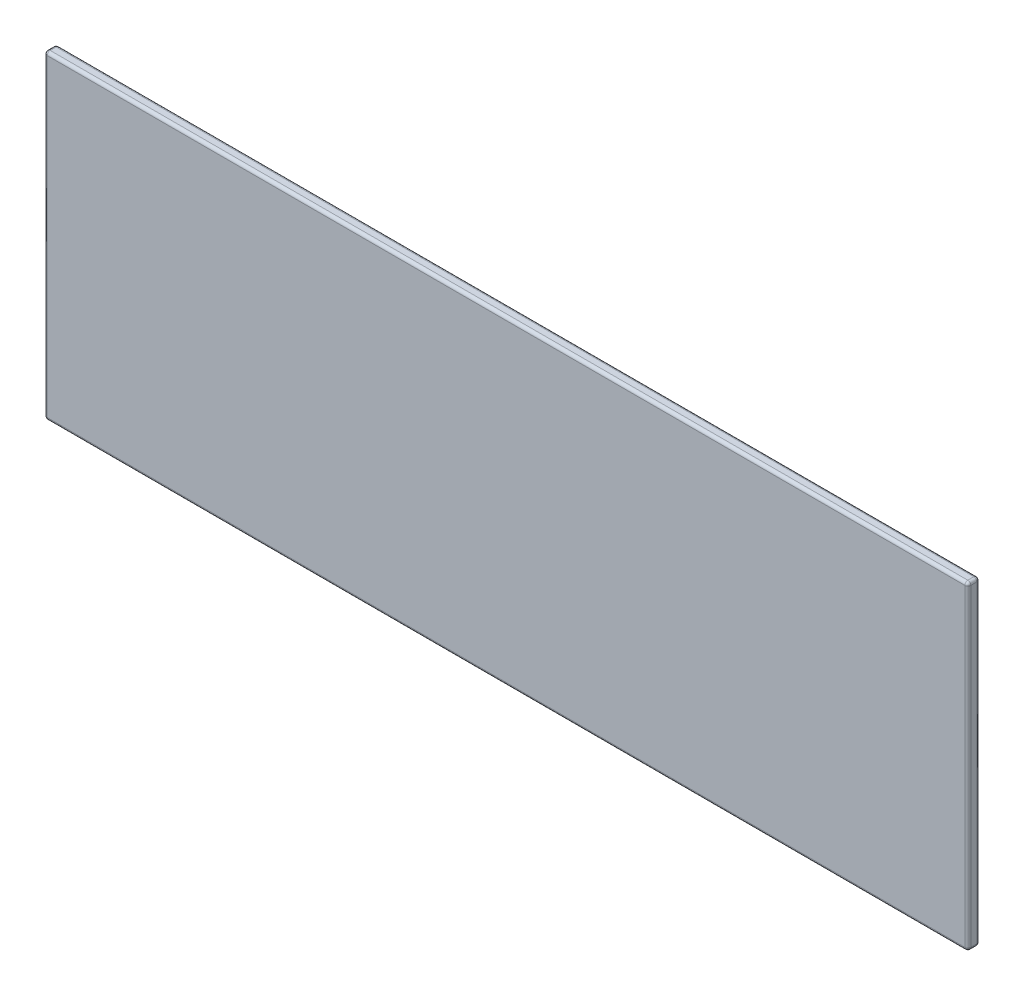
ISO-10303-21;
HEADER;
FILE_DESCRIPTION(('STEP AP214'),'2;1');
FILE_NAME('part.step','',(''),(''),'','','');
FILE_SCHEMA(('AUTOMOTIVE_DESIGN { 1 0 10303 214 1 1 1 1 }'));
ENDSEC;
DATA;
#1=APPLICATION_CONTEXT('core data for automotive mechanical design processes');
#2=APPLICATION_PROTOCOL_DEFINITION('international standard','automotive_design',2000,#1);
#3=PRODUCT_CONTEXT('',#1,'mechanical');
#4=PRODUCT('Part','Part','',(#3));
#5=PRODUCT_RELATED_PRODUCT_CATEGORY('part','',(#4));
#6=PRODUCT_DEFINITION_FORMATION('','',#4);
#7=PRODUCT_DEFINITION_CONTEXT('part definition',#1,'design');
#8=PRODUCT_DEFINITION('design','',#6,#7);
#9=PRODUCT_DEFINITION_SHAPE('','',#8);
#10=(LENGTH_UNIT() NAMED_UNIT(*) SI_UNIT(.MILLI.,.METRE.));
#11=(NAMED_UNIT(*) PLANE_ANGLE_UNIT() SI_UNIT($,.RADIAN.));
#12=(NAMED_UNIT(*) SI_UNIT($,.STERADIAN.) SOLID_ANGLE_UNIT());
#13=UNCERTAINTY_MEASURE_WITH_UNIT(LENGTH_MEASURE(1.E-05),#10,'distance_accuracy_value','');
#14=(GEOMETRIC_REPRESENTATION_CONTEXT(3) GLOBAL_UNCERTAINTY_ASSIGNED_CONTEXT((#13)) GLOBAL_UNIT_ASSIGNED_CONTEXT((#10,
#11,#12)) REPRESENTATION_CONTEXT('',''));
#15=CARTESIAN_POINT('',(0.,0.,0.));
#16=DIRECTION('',(0.,0.,1.));
#17=DIRECTION('',(1.,0.,0.));
#18=AXIS2_PLACEMENT_3D('',#15,#16,#17);
#19=CARTESIAN_POINT('',(77.35,-26.75,2.));
#20=DIRECTION('',(-1.,0.,0.));
#21=DIRECTION('',(0.,0.,1.));
#22=AXIS2_PLACEMENT_3D('',#19,#20,#21);
#23=PLANE('',#22);
#24=DIRECTION('',(0.,1.,0.));
#25=VECTOR('',#24,1.);
#26=CARTESIAN_POINT('',(77.35,-26.75,1.5));
#27=LINE('',#26,#25);
#28=CARTESIAN_POINT('',(77.35,26.25,1.5));
#29=VERTEX_POINT('',#28);
#30=CARTESIAN_POINT('',(77.35,-26.25,1.5));
#31=VERTEX_POINT('',#30);
#32=EDGE_CURVE('E42',#29,#31,#27,.F.);
#33=ORIENTED_EDGE('',*,*,#32,.T.);
#34=DIRECTION('',(0.,0.,-1.));
#35=VECTOR('',#34,1.);
#36=CARTESIAN_POINT('',(77.35,-26.25,2.));
#37=LINE('',#36,#35);
#38=CARTESIAN_POINT('',(77.35,-26.25,0.5));
#39=VERTEX_POINT('',#38);
#40=EDGE_CURVE('E11',#31,#39,#37,.T.);
#41=ORIENTED_EDGE('',*,*,#40,.T.);
#42=DIRECTION('',(0.,1.,0.));
#43=VECTOR('',#42,1.);
#44=CARTESIAN_POINT('',(77.35,26.75,0.5));
#45=LINE('',#44,#43);
#46=CARTESIAN_POINT('',(77.35,26.25,0.5));
#47=VERTEX_POINT('',#46);
#48=EDGE_CURVE('E194',#39,#47,#45,.T.);
#49=ORIENTED_EDGE('',*,*,#48,.T.);
#50=DIRECTION('',(0.,0.,-1.));
#51=VECTOR('',#50,1.);
#52=CARTESIAN_POINT('',(77.35,26.25,2.));
#53=LINE('',#52,#51);
#54=EDGE_CURVE('E53',#47,#29,#53,.F.);
#55=ORIENTED_EDGE('',*,*,#54,.T.);
#56=EDGE_LOOP('',(#33,#41,#49,#55));
#57=FACE_BOUND('',#56,.T.);
#58=ADVANCED_FACE('F33',(#57),#23,.F.);
#59=CARTESIAN_POINT('',(-77.35,26.75,2.));
#60=DIRECTION('',(0.,-1.,0.));
#61=DIRECTION('',(0.,0.,-1.));
#62=AXIS2_PLACEMENT_3D('',#59,#60,#61);
#63=PLANE('',#62);
#64=DIRECTION('',(0.,0.,-1.));
#65=VECTOR('',#64,1.);
#66=CARTESIAN_POINT('',(-76.85,26.75,2.));
#67=LINE('',#66,#65);
#68=CARTESIAN_POINT('',(-76.85,26.75,0.5));
#69=VERTEX_POINT('',#68);
#70=CARTESIAN_POINT('',(-76.85,26.75,1.5));
#71=VERTEX_POINT('',#70);
#72=EDGE_CURVE('E189',#69,#71,#67,.F.);
#73=ORIENTED_EDGE('',*,*,#72,.T.);
#74=DIRECTION('',(-1.,0.,0.));
#75=VECTOR('',#74,1.);
#76=CARTESIAN_POINT('',(-77.35,26.75,1.5));
#77=LINE('',#76,#75);
#78=CARTESIAN_POINT('',(76.85,26.75,1.5));
#79=VERTEX_POINT('',#78);
#80=EDGE_CURVE('E191',#71,#79,#77,.F.);
#81=ORIENTED_EDGE('',*,*,#80,.T.);
#82=DIRECTION('',(0.,0.,-1.));
#83=VECTOR('',#82,1.);
#84=CARTESIAN_POINT('',(76.85,26.75,2.));
#85=LINE('',#84,#83);
#86=CARTESIAN_POINT('',(76.85,26.75,0.5));
#87=VERTEX_POINT('',#86);
#88=EDGE_CURVE('E185',#79,#87,#85,.T.);
#89=ORIENTED_EDGE('',*,*,#88,.T.);
#90=DIRECTION('',(-1.,0.,0.));
#91=VECTOR('',#90,1.);
#92=CARTESIAN_POINT('',(-77.35,26.75,0.5));
#93=LINE('',#92,#91);
#94=EDGE_CURVE('E187',#87,#69,#93,.T.);
#95=ORIENTED_EDGE('',*,*,#94,.T.);
#96=EDGE_LOOP('',(#73,#81,#89,#95));
#97=FACE_BOUND('',#96,.T.);
#98=ADVANCED_FACE('F278',(#97),#63,.F.);
#99=CARTESIAN_POINT('',(-77.35,-26.75,2.));
#100=DIRECTION('',(1.,0.,0.));
#101=DIRECTION('',(0.,0.,-1.));
#102=AXIS2_PLACEMENT_3D('',#99,#100,#101);
#103=PLANE('',#102);
#104=DIRECTION('',(0.,0.,-1.));
#105=VECTOR('',#104,1.);
#106=CARTESIAN_POINT('',(-77.35,-26.25,2.));
#107=LINE('',#106,#105);
#108=CARTESIAN_POINT('',(-77.35,-26.25,0.5));
#109=VERTEX_POINT('',#108);
#110=CARTESIAN_POINT('',(-77.35,-26.25,1.5));
#111=VERTEX_POINT('',#110);
#112=EDGE_CURVE('E180',#109,#111,#107,.F.);
#113=ORIENTED_EDGE('',*,*,#112,.T.);
#114=DIRECTION('',(0.,-1.,0.));
#115=VECTOR('',#114,1.);
#116=CARTESIAN_POINT('',(-77.35,-26.75,1.5));
#117=LINE('',#116,#115);
#118=CARTESIAN_POINT('',(-77.35,26.25,1.5));
#119=VERTEX_POINT('',#118);
#120=EDGE_CURVE('E182',#111,#119,#117,.F.);
#121=ORIENTED_EDGE('',*,*,#120,.T.);
#122=DIRECTION('',(0.,0.,-1.));
#123=VECTOR('',#122,1.);
#124=CARTESIAN_POINT('',(-77.35,26.25,2.));
#125=LINE('',#124,#123);
#126=CARTESIAN_POINT('',(-77.35,26.25,0.5));
#127=VERTEX_POINT('',#126);
#128=EDGE_CURVE('E176',#119,#127,#125,.T.);
#129=ORIENTED_EDGE('',*,*,#128,.T.);
#130=DIRECTION('',(0.,-1.,0.));
#131=VECTOR('',#130,1.);
#132=CARTESIAN_POINT('',(-77.35,-26.75,0.5));
#133=LINE('',#132,#131);
#134=EDGE_CURVE('E178',#127,#109,#133,.T.);
#135=ORIENTED_EDGE('',*,*,#134,.T.);
#136=EDGE_LOOP('',(#113,#121,#129,#135));
#137=FACE_BOUND('',#136,.T.);
#138=ADVANCED_FACE('F269',(#137),#103,.F.);
#139=CARTESIAN_POINT('',(-77.35,-26.75,2.));
#140=DIRECTION('',(0.,1.,0.));
#141=DIRECTION('',(0.,0.,1.));
#142=AXIS2_PLACEMENT_3D('',#139,#140,#141);
#143=PLANE('',#142);
#144=DIRECTION('',(1.,0.,0.));
#145=VECTOR('',#144,1.);
#146=CARTESIAN_POINT('',(-77.35,-26.75,1.5));
#147=LINE('',#146,#145);
#148=CARTESIAN_POINT('',(76.85,-26.75,1.5));
#149=VERTEX_POINT('',#148);
#150=CARTESIAN_POINT('',(-76.85,-26.75,1.5));
#151=VERTEX_POINT('',#150);
#152=EDGE_CURVE('E129',#149,#151,#147,.F.);
#153=ORIENTED_EDGE('',*,*,#152,.T.);
#154=DIRECTION('',(0.,0.,-1.));
#155=VECTOR('',#154,1.);
#156=CARTESIAN_POINT('',(-76.85,-26.75,2.));
#157=LINE('',#156,#155);
#158=CARTESIAN_POINT('',(-76.85,-26.75,0.5));
#159=VERTEX_POINT('',#158);
#160=EDGE_CURVE('E165',#151,#159,#157,.T.);
#161=ORIENTED_EDGE('',*,*,#160,.T.);
#162=DIRECTION('',(1.,0.,0.));
#163=VECTOR('',#162,1.);
#164=CARTESIAN_POINT('',(77.35,-26.75,0.5));
#165=LINE('',#164,#163);
#166=CARTESIAN_POINT('',(76.85,-26.75,0.5));
#167=VERTEX_POINT('',#166);
#168=EDGE_CURVE('E158',#159,#167,#165,.T.);
#169=ORIENTED_EDGE('',*,*,#168,.T.);
#170=DIRECTION('',(0.,0.,-1.));
#171=VECTOR('',#170,1.);
#172=CARTESIAN_POINT('',(76.85,-26.75,2.));
#173=LINE('',#172,#171);
#174=EDGE_CURVE('E156',#167,#149,#173,.F.);
#175=ORIENTED_EDGE('',*,*,#174,.T.);
#176=EDGE_LOOP('',(#153,#161,#169,#175));
#177=FACE_BOUND('',#176,.T.);
#178=ADVANCED_FACE('F356',(#177),#143,.F.);
#179=CARTESIAN_POINT('',(0.,0.,2.));
#180=DIRECTION('',(0.,0.,-1.));
#181=DIRECTION('',(-1.,0.,0.));
#182=AXIS2_PLACEMENT_3D('',#179,#180,#181);
#183=PLANE('',#182);
#184=DIRECTION('',(0.,-1.,0.));
#185=VECTOR('',#184,1.);
#186=CARTESIAN_POINT('',(-76.85,0.,2.));
#187=LINE('',#186,#185);
#188=CARTESIAN_POINT('',(-76.85,26.25,2.));
#189=VERTEX_POINT('',#188);
#190=CARTESIAN_POINT('',(-76.85,-26.25,2.));
#191=VERTEX_POINT('',#190);
#192=EDGE_CURVE('E154',#189,#191,#187,.T.);
#193=ORIENTED_EDGE('',*,*,#192,.T.);
#194=DIRECTION('',(1.,0.,0.));
#195=VECTOR('',#194,1.);
#196=CARTESIAN_POINT('',(0.,-26.25,2.));
#197=LINE('',#196,#195);
#198=CARTESIAN_POINT('',(76.85,-26.25,2.));
#199=VERTEX_POINT('',#198);
#200=EDGE_CURVE('E127',#191,#199,#197,.T.);
#201=ORIENTED_EDGE('',*,*,#200,.T.);
#202=DIRECTION('',(0.,1.,0.));
#203=VECTOR('',#202,1.);
#204=CARTESIAN_POINT('',(76.85,0.,2.));
#205=LINE('',#204,#203);
#206=CARTESIAN_POINT('',(76.85,26.25,2.));
#207=VERTEX_POINT('',#206);
#208=EDGE_CURVE('E144',#199,#207,#205,.T.);
#209=ORIENTED_EDGE('',*,*,#208,.T.);
#210=DIRECTION('',(-1.,0.,0.));
#211=VECTOR('',#210,1.);
#212=CARTESIAN_POINT('',(0.,26.25,2.));
#213=LINE('',#212,#211);
#214=EDGE_CURVE('E150',#207,#189,#213,.T.);
#215=ORIENTED_EDGE('',*,*,#214,.T.);
#216=EDGE_LOOP('',(#193,#201,#209,#215));
#217=FACE_BOUND('',#216,.T.);
#218=ADVANCED_FACE('F152',(#217),#183,.F.);
#219=CARTESIAN_POINT('',(0.,0.,0.));
#220=DIRECTION('',(0.,0.,-1.));
#221=DIRECTION('',(-1.,0.,0.));
#222=AXIS2_PLACEMENT_3D('',#219,#220,#221);
#223=PLANE('',#222);
#224=DIRECTION('',(0.,1.,0.));
#225=VECTOR('',#224,1.);
#226=CARTESIAN_POINT('',(76.85,-26.75,0.));
#227=LINE('',#226,#225);
#228=CARTESIAN_POINT('',(76.85,26.25,0.));
#229=VERTEX_POINT('',#228);
#230=CARTESIAN_POINT('',(76.85,-26.25,0.));
#231=VERTEX_POINT('',#230);
#232=EDGE_CURVE('E167',#229,#231,#227,.F.);
#233=ORIENTED_EDGE('',*,*,#232,.T.);
#234=DIRECTION('',(1.,0.,0.));
#235=VECTOR('',#234,1.);
#236=CARTESIAN_POINT('',(-77.35,-26.25,0.));
#237=LINE('',#236,#235);
#238=CARTESIAN_POINT('',(-76.85,-26.25,0.));
#239=VERTEX_POINT('',#238);
#240=EDGE_CURVE('E173',#231,#239,#237,.F.);
#241=ORIENTED_EDGE('',*,*,#240,.T.);
#242=DIRECTION('',(0.,-1.,0.));
#243=VECTOR('',#242,1.);
#244=CARTESIAN_POINT('',(-76.85,26.75,0.));
#245=LINE('',#244,#243);
#246=CARTESIAN_POINT('',(-76.85,26.25,0.));
#247=VERTEX_POINT('',#246);
#248=EDGE_CURVE('E171',#239,#247,#245,.F.);
#249=ORIENTED_EDGE('',*,*,#248,.T.);
#250=DIRECTION('',(-1.,0.,0.));
#251=VECTOR('',#250,1.);
#252=CARTESIAN_POINT('',(77.35,26.25,0.));
#253=LINE('',#252,#251);
#254=EDGE_CURVE('E169',#247,#229,#253,.F.);
#255=ORIENTED_EDGE('',*,*,#254,.T.);
#256=EDGE_LOOP('',(#233,#241,#249,#255));
#257=FACE_BOUND('',#256,.T.);
#258=ADVANCED_FACE('F296',(#257),#223,.T.);
#259=CARTESIAN_POINT('',(-77.35,26.25,0.5));
#260=DIRECTION('',(1.,0.,0.));
#261=DIRECTION('',(0.,0.,-1.));
#262=AXIS2_PLACEMENT_3D('',#259,#260,#261);
#263=CYLINDRICAL_SURFACE('',#262,0.5);
#264=CARTESIAN_POINT('',(-76.85,26.25,0.5));
#265=DIRECTION('',(-1.,0.,0.));
#266=DIRECTION('',(0.,0.,1.));
#267=AXIS2_PLACEMENT_3D('',#264,#265,#266);
#268=CIRCLE('',#267,0.5);
#269=EDGE_CURVE('E37',#69,#247,#268,.T.);
#270=ORIENTED_EDGE('',*,*,#269,.F.);
#271=ORIENTED_EDGE('',*,*,#94,.F.);
#272=CARTESIAN_POINT('',(76.85,26.25,0.5));
#273=DIRECTION('',(1.,0.,0.));
#274=DIRECTION('',(0.,0.,-1.));
#275=AXIS2_PLACEMENT_3D('',#272,#273,#274);
#276=CIRCLE('',#275,0.5);
#277=EDGE_CURVE('E246',#229,#87,#276,.T.);
#278=ORIENTED_EDGE('',*,*,#277,.F.);
#279=ORIENTED_EDGE('',*,*,#254,.F.);
#280=EDGE_LOOP('',(#270,#271,#278,#279));
#281=FACE_BOUND('',#280,.T.);
#282=ADVANCED_FACE('F35',(#281),#263,.T.);
#283=CARTESIAN_POINT('',(-76.85,26.25,0.5));
#284=DIRECTION('',(0.,0.,1.));
#285=DIRECTION('',(1.,0.,0.));
#286=AXIS2_PLACEMENT_3D('',#283,#284,#285);
#287=SPHERICAL_SURFACE('',#286,0.5);
#288=CARTESIAN_POINT('',(-76.85,26.25,0.5));
#289=DIRECTION('',(0.,0.,-1.));
#290=DIRECTION('',(-1.,0.,0.));
#291=AXIS2_PLACEMENT_3D('',#288,#289,#290);
#292=CIRCLE('',#291,0.5);
#293=EDGE_CURVE('E241',#69,#127,#292,.F.);
#294=ORIENTED_EDGE('',*,*,#293,.F.);
#295=ORIENTED_EDGE('',*,*,#269,.T.);
#296=CARTESIAN_POINT('',(-76.85,26.25,0.5));
#297=DIRECTION('',(0.,1.,0.));
#298=DIRECTION('',(0.,0.,1.));
#299=AXIS2_PLACEMENT_3D('',#296,#297,#298);
#300=CIRCLE('',#299,0.5);
#301=EDGE_CURVE('E244',#127,#247,#300,.F.);
#302=ORIENTED_EDGE('',*,*,#301,.F.);
#303=EDGE_LOOP('',(#294,#295,#302));
#304=FACE_BOUND('',#303,.T.);
#305=ADVANCED_FACE('F257',(#304),#287,.T.);
#306=CARTESIAN_POINT('',(76.85,26.25,0.5));
#307=DIRECTION('',(0.,0.,1.));
#308=DIRECTION('',(1.,0.,0.));
#309=AXIS2_PLACEMENT_3D('',#306,#307,#308);
#310=SPHERICAL_SURFACE('',#309,0.5);
#311=CARTESIAN_POINT('',(76.85,26.25,0.5));
#312=DIRECTION('',(0.,1.,0.));
#313=DIRECTION('',(0.,0.,1.));
#314=AXIS2_PLACEMENT_3D('',#311,#312,#313);
#315=CIRCLE('',#314,0.5);
#316=EDGE_CURVE('E235',#229,#47,#315,.F.);
#317=ORIENTED_EDGE('',*,*,#316,.F.);
#318=ORIENTED_EDGE('',*,*,#277,.T.);
#319=CARTESIAN_POINT('',(76.85,26.25,0.5));
#320=DIRECTION('',(0.,0.,-1.));
#321=DIRECTION('',(-1.,0.,0.));
#322=AXIS2_PLACEMENT_3D('',#319,#320,#321);
#323=CIRCLE('',#322,0.5);
#324=EDGE_CURVE('E238',#47,#87,#323,.F.);
#325=ORIENTED_EDGE('',*,*,#324,.F.);
#326=EDGE_LOOP('',(#317,#318,#325));
#327=FACE_BOUND('',#326,.T.);
#328=ADVANCED_FACE('F289',(#327),#310,.T.);
#329=CARTESIAN_POINT('',(-76.85,-26.75,0.5));
#330=DIRECTION('',(0.,1.,0.));
#331=DIRECTION('',(0.,0.,1.));
#332=AXIS2_PLACEMENT_3D('',#329,#330,#331);
#333=CYLINDRICAL_SURFACE('',#332,0.5);
#334=ORIENTED_EDGE('',*,*,#301,.T.);
#335=ORIENTED_EDGE('',*,*,#248,.F.);
#336=CARTESIAN_POINT('',(-76.85,-26.25,0.5));
#337=DIRECTION('',(0.,-1.,0.));
#338=DIRECTION('',(0.,0.,-1.));
#339=AXIS2_PLACEMENT_3D('',#336,#337,#338);
#340=CIRCLE('',#339,0.5);
#341=EDGE_CURVE('E230',#109,#239,#340,.T.);
#342=ORIENTED_EDGE('',*,*,#341,.F.);
#343=ORIENTED_EDGE('',*,*,#134,.F.);
#344=EDGE_LOOP('',(#334,#335,#342,#343));
#345=FACE_BOUND('',#344,.T.);
#346=ADVANCED_FACE('F265',(#345),#333,.T.);
#347=CARTESIAN_POINT('',(-76.85,26.25,2.));
#348=DIRECTION('',(0.,0.,-1.));
#349=DIRECTION('',(-1.,0.,0.));
#350=AXIS2_PLACEMENT_3D('',#347,#348,#349);
#351=CYLINDRICAL_SURFACE('',#350,0.5);
#352=ORIENTED_EDGE('',*,*,#293,.T.);
#353=ORIENTED_EDGE('',*,*,#128,.F.);
#354=CARTESIAN_POINT('',(-76.85,26.25,1.5));
#355=DIRECTION('',(0.,0.,1.));
#356=DIRECTION('',(1.,0.,0.));
#357=AXIS2_PLACEMENT_3D('',#354,#355,#356);
#358=CIRCLE('',#357,0.5);
#359=EDGE_CURVE('E227',#71,#119,#358,.T.);
#360=ORIENTED_EDGE('',*,*,#359,.F.);
#361=ORIENTED_EDGE('',*,*,#72,.F.);
#362=EDGE_LOOP('',(#352,#353,#360,#361));
#363=FACE_BOUND('',#362,.T.);
#364=ADVANCED_FACE('F275',(#363),#351,.T.);
#365=CARTESIAN_POINT('',(0.,26.25,1.5));
#366=DIRECTION('',(-1.,0.,0.));
#367=DIRECTION('',(0.,0.,1.));
#368=AXIS2_PLACEMENT_3D('',#365,#366,#367);
#369=CYLINDRICAL_SURFACE('',#368,0.5);
#370=CARTESIAN_POINT('',(76.85,26.25,1.5));
#371=DIRECTION('',(1.,0.,0.));
#372=DIRECTION('',(0.,0.,-1.));
#373=AXIS2_PLACEMENT_3D('',#370,#371,#372);
#374=CIRCLE('',#373,0.5);
#375=EDGE_CURVE('E221',#79,#207,#374,.T.);
#376=ORIENTED_EDGE('',*,*,#375,.F.);
#377=ORIENTED_EDGE('',*,*,#80,.F.);
#378=CARTESIAN_POINT('',(-76.85,26.25,1.5));
#379=DIRECTION('',(-1.,0.,0.));
#380=DIRECTION('',(0.,0.,1.));
#381=AXIS2_PLACEMENT_3D('',#378,#379,#380);
#382=CIRCLE('',#381,0.5);
#383=EDGE_CURVE('E224',#189,#71,#382,.T.);
#384=ORIENTED_EDGE('',*,*,#383,.F.);
#385=ORIENTED_EDGE('',*,*,#214,.F.);
#386=EDGE_LOOP('',(#376,#377,#384,#385));
#387=FACE_BOUND('',#386,.T.);
#388=ADVANCED_FACE('F282',(#387),#369,.T.);
#389=CARTESIAN_POINT('',(76.85,26.25,2.));
#390=DIRECTION('',(0.,0.,-1.));
#391=DIRECTION('',(-1.,0.,0.));
#392=AXIS2_PLACEMENT_3D('',#389,#390,#391);
#393=CYLINDRICAL_SURFACE('',#392,0.5);
#394=ORIENTED_EDGE('',*,*,#324,.T.);
#395=ORIENTED_EDGE('',*,*,#88,.F.);
#396=CARTESIAN_POINT('',(76.85,26.25,1.5));
#397=DIRECTION('',(0.,0.,1.));
#398=DIRECTION('',(1.,0.,0.));
#399=AXIS2_PLACEMENT_3D('',#396,#397,#398);
#400=CIRCLE('',#399,0.5);
#401=EDGE_CURVE('E219',#29,#79,#400,.T.);
#402=ORIENTED_EDGE('',*,*,#401,.F.);
#403=ORIENTED_EDGE('',*,*,#54,.F.);
#404=EDGE_LOOP('',(#394,#395,#402,#403));
#405=FACE_BOUND('',#404,.T.);
#406=ADVANCED_FACE('F287',(#405),#393,.T.);
#407=CARTESIAN_POINT('',(76.85,-26.75,0.5));
#408=DIRECTION('',(0.,-1.,0.));
#409=DIRECTION('',(0.,0.,-1.));
#410=AXIS2_PLACEMENT_3D('',#407,#408,#409);
#411=CYLINDRICAL_SURFACE('',#410,0.5);
#412=ORIENTED_EDGE('',*,*,#316,.T.);
#413=ORIENTED_EDGE('',*,*,#48,.F.);
#414=CARTESIAN_POINT('',(76.85,-26.25,0.5));
#415=DIRECTION('',(0.,-1.,0.));
#416=DIRECTION('',(0.,0.,-1.));
#417=AXIS2_PLACEMENT_3D('',#414,#415,#416);
#418=CIRCLE('',#417,0.5);
#419=EDGE_CURVE('E216',#231,#39,#418,.T.);
#420=ORIENTED_EDGE('',*,*,#419,.F.);
#421=ORIENTED_EDGE('',*,*,#232,.F.);
#422=EDGE_LOOP('',(#412,#413,#420,#421));
#423=FACE_BOUND('',#422,.T.);
#424=ADVANCED_FACE('F293',(#423),#411,.T.);
#425=CARTESIAN_POINT('',(-77.35,-26.25,0.5));
#426=DIRECTION('',(-1.,0.,0.));
#427=DIRECTION('',(0.,0.,1.));
#428=AXIS2_PLACEMENT_3D('',#425,#426,#427);
#429=CYLINDRICAL_SURFACE('',#428,0.5);
#430=CARTESIAN_POINT('',(-76.85,-26.25,0.5));
#431=DIRECTION('',(-1.,0.,0.));
#432=DIRECTION('',(0.,0.,1.));
#433=AXIS2_PLACEMENT_3D('',#430,#431,#432);
#434=CIRCLE('',#433,0.5);
#435=EDGE_CURVE('E232',#239,#159,#434,.T.);
#436=ORIENTED_EDGE('',*,*,#435,.F.);
#437=ORIENTED_EDGE('',*,*,#240,.F.);
#438=CARTESIAN_POINT('',(76.85,-26.25,0.5));
#439=DIRECTION('',(1.,0.,0.));
#440=DIRECTION('',(0.,0.,-1.));
#441=AXIS2_PLACEMENT_3D('',#438,#439,#440);
#442=CIRCLE('',#441,0.5);
#443=EDGE_CURVE('E213',#167,#231,#442,.T.);
#444=ORIENTED_EDGE('',*,*,#443,.F.);
#445=ORIENTED_EDGE('',*,*,#168,.F.);
#446=EDGE_LOOP('',(#436,#437,#444,#445));
#447=FACE_BOUND('',#446,.T.);
#448=ADVANCED_FACE('F300',(#447),#429,.T.);
#449=CARTESIAN_POINT('',(-76.85,-26.25,0.5));
#450=DIRECTION('',(0.,0.,1.));
#451=DIRECTION('',(1.,0.,0.));
#452=AXIS2_PLACEMENT_3D('',#449,#450,#451);
#453=SPHERICAL_SURFACE('',#452,0.5);
#454=ORIENTED_EDGE('',*,*,#341,.T.);
#455=ORIENTED_EDGE('',*,*,#435,.T.);
#456=CARTESIAN_POINT('',(-76.85,-26.25,0.5));
#457=DIRECTION('',(0.,0.,-1.));
#458=DIRECTION('',(-1.,0.,0.));
#459=AXIS2_PLACEMENT_3D('',#456,#457,#458);
#460=CIRCLE('',#459,0.5);
#461=EDGE_CURVE('E210',#109,#159,#460,.F.);
#462=ORIENTED_EDGE('',*,*,#461,.F.);
#463=EDGE_LOOP('',(#454,#455,#462));
#464=FACE_BOUND('',#463,.T.);
#465=ADVANCED_FACE('F304',(#464),#453,.T.);
#466=CARTESIAN_POINT('',(-76.85,26.25,1.5));
#467=DIRECTION('',(0.,0.,1.));
#468=DIRECTION('',(1.,0.,0.));
#469=AXIS2_PLACEMENT_3D('',#466,#467,#468);
#470=SPHERICAL_SURFACE('',#469,0.5);
#471=ORIENTED_EDGE('',*,*,#383,.T.);
#472=ORIENTED_EDGE('',*,*,#359,.T.);
#473=CARTESIAN_POINT('',(-76.85,26.25,1.5));
#474=DIRECTION('',(0.,1.,0.));
#475=DIRECTION('',(0.,0.,1.));
#476=AXIS2_PLACEMENT_3D('',#473,#474,#475);
#477=CIRCLE('',#476,0.5);
#478=EDGE_CURVE('E208',#189,#119,#477,.F.);
#479=ORIENTED_EDGE('',*,*,#478,.F.);
#480=EDGE_LOOP('',(#471,#472,#479));
#481=FACE_BOUND('',#480,.T.);
#482=ADVANCED_FACE('F315',(#481),#470,.T.);
#483=CARTESIAN_POINT('',(76.85,26.25,1.5));
#484=DIRECTION('',(0.,0.,1.));
#485=DIRECTION('',(1.,0.,0.));
#486=AXIS2_PLACEMENT_3D('',#483,#484,#485);
#487=SPHERICAL_SURFACE('',#486,0.5);
#488=ORIENTED_EDGE('',*,*,#401,.T.);
#489=ORIENTED_EDGE('',*,*,#375,.T.);
#490=CARTESIAN_POINT('',(76.85,26.25,1.5));
#491=DIRECTION('',(0.,1.,0.));
#492=DIRECTION('',(0.,0.,1.));
#493=AXIS2_PLACEMENT_3D('',#490,#491,#492);
#494=CIRCLE('',#493,0.5);
#495=EDGE_CURVE('E147',#29,#207,#494,.F.);
#496=ORIENTED_EDGE('',*,*,#495,.F.);
#497=EDGE_LOOP('',(#488,#489,#496));
#498=FACE_BOUND('',#497,.T.);
#499=ADVANCED_FACE('F317',(#498),#487,.T.);
#500=CARTESIAN_POINT('',(76.85,-26.25,0.5));
#501=DIRECTION('',(0.,0.,1.));
#502=DIRECTION('',(1.,0.,0.));
#503=AXIS2_PLACEMENT_3D('',#500,#501,#502);
#504=SPHERICAL_SURFACE('',#503,0.5);
#505=ORIENTED_EDGE('',*,*,#443,.T.);
#506=ORIENTED_EDGE('',*,*,#419,.T.);
#507=CARTESIAN_POINT('',(76.85,-26.25,0.5));
#508=DIRECTION('',(0.,0.,-1.));
#509=DIRECTION('',(-1.,0.,0.));
#510=AXIS2_PLACEMENT_3D('',#507,#508,#509);
#511=CIRCLE('',#510,0.5);
#512=EDGE_CURVE('E205',#167,#39,#511,.F.);
#513=ORIENTED_EDGE('',*,*,#512,.F.);
#514=EDGE_LOOP('',(#505,#506,#513));
#515=FACE_BOUND('',#514,.T.);
#516=ADVANCED_FACE('F323',(#515),#504,.T.);
#517=CARTESIAN_POINT('',(-76.85,-26.25,2.));
#518=DIRECTION('',(0.,0.,-1.));
#519=DIRECTION('',(-1.,0.,0.));
#520=AXIS2_PLACEMENT_3D('',#517,#518,#519);
#521=CYLINDRICAL_SURFACE('',#520,0.5);
#522=ORIENTED_EDGE('',*,*,#461,.T.);
#523=ORIENTED_EDGE('',*,*,#160,.F.);
#524=CARTESIAN_POINT('',(-76.85,-26.25,1.5));
#525=DIRECTION('',(0.,0.,1.));
#526=DIRECTION('',(1.,0.,0.));
#527=AXIS2_PLACEMENT_3D('',#524,#525,#526);
#528=CIRCLE('',#527,0.5);
#529=EDGE_CURVE('E202',#111,#151,#528,.T.);
#530=ORIENTED_EDGE('',*,*,#529,.F.);
#531=ORIENTED_EDGE('',*,*,#112,.F.);
#532=EDGE_LOOP('',(#522,#523,#530,#531));
#533=FACE_BOUND('',#532,.T.);
#534=ADVANCED_FACE('F307',(#533),#521,.T.);
#535=CARTESIAN_POINT('',(-76.85,0.,1.5));
#536=DIRECTION('',(0.,-1.,0.));
#537=DIRECTION('',(0.,0.,-1.));
#538=AXIS2_PLACEMENT_3D('',#535,#536,#537);
#539=CYLINDRICAL_SURFACE('',#538,0.5);
#540=ORIENTED_EDGE('',*,*,#478,.T.);
#541=ORIENTED_EDGE('',*,*,#120,.F.);
#542=CARTESIAN_POINT('',(-76.85,-26.25,1.5));
#543=DIRECTION('',(0.,-1.,0.));
#544=DIRECTION('',(0.,0.,-1.));
#545=AXIS2_PLACEMENT_3D('',#542,#543,#544);
#546=CIRCLE('',#545,0.5);
#547=EDGE_CURVE('E141',#191,#111,#546,.T.);
#548=ORIENTED_EDGE('',*,*,#547,.F.);
#549=ORIENTED_EDGE('',*,*,#192,.F.);
#550=EDGE_LOOP('',(#540,#541,#548,#549));
#551=FACE_BOUND('',#550,.T.);
#552=ADVANCED_FACE('F313',(#551),#539,.T.);
#553=CARTESIAN_POINT('',(76.85,0.,1.5));
#554=DIRECTION('',(0.,1.,0.));
#555=DIRECTION('',(0.,0.,1.));
#556=AXIS2_PLACEMENT_3D('',#553,#554,#555);
#557=CYLINDRICAL_SURFACE('',#556,0.5);
#558=ORIENTED_EDGE('',*,*,#495,.T.);
#559=ORIENTED_EDGE('',*,*,#208,.F.);
#560=CARTESIAN_POINT('',(76.85,-26.25,1.5));
#561=DIRECTION('',(0.,-1.,0.));
#562=DIRECTION('',(0.,0.,-1.));
#563=AXIS2_PLACEMENT_3D('',#560,#561,#562);
#564=CIRCLE('',#563,0.5);
#565=EDGE_CURVE('E135',#31,#199,#564,.T.);
#566=ORIENTED_EDGE('',*,*,#565,.F.);
#567=ORIENTED_EDGE('',*,*,#32,.F.);
#568=EDGE_LOOP('',(#558,#559,#566,#567));
#569=FACE_BOUND('',#568,.T.);
#570=ADVANCED_FACE('F145',(#569),#557,.T.);
#571=CARTESIAN_POINT('',(76.85,-26.25,2.));
#572=DIRECTION('',(0.,0.,-1.));
#573=DIRECTION('',(-1.,0.,0.));
#574=AXIS2_PLACEMENT_3D('',#571,#572,#573);
#575=CYLINDRICAL_SURFACE('',#574,0.5);
#576=ORIENTED_EDGE('',*,*,#512,.T.);
#577=ORIENTED_EDGE('',*,*,#40,.F.);
#578=CARTESIAN_POINT('',(76.85,-26.25,1.5));
#579=DIRECTION('',(0.,0.,1.));
#580=DIRECTION('',(1.,0.,0.));
#581=AXIS2_PLACEMENT_3D('',#578,#579,#580);
#582=CIRCLE('',#581,0.5);
#583=EDGE_CURVE('E139',#149,#31,#582,.T.);
#584=ORIENTED_EDGE('',*,*,#583,.F.);
#585=ORIENTED_EDGE('',*,*,#174,.F.);
#586=EDGE_LOOP('',(#576,#577,#584,#585));
#587=FACE_BOUND('',#586,.T.);
#588=ADVANCED_FACE('F340',(#587),#575,.T.);
#589=CARTESIAN_POINT('',(-76.85,-26.25,1.5));
#590=DIRECTION('',(0.,0.,1.));
#591=DIRECTION('',(1.,0.,0.));
#592=AXIS2_PLACEMENT_3D('',#589,#590,#591);
#593=SPHERICAL_SURFACE('',#592,0.5);
#594=ORIENTED_EDGE('',*,*,#547,.T.);
#595=ORIENTED_EDGE('',*,*,#529,.T.);
#596=CARTESIAN_POINT('',(-76.85,-26.25,1.5));
#597=DIRECTION('',(-1.,0.,0.));
#598=DIRECTION('',(0.,0.,1.));
#599=AXIS2_PLACEMENT_3D('',#596,#597,#598);
#600=CIRCLE('',#599,0.5);
#601=EDGE_CURVE('E132',#191,#151,#600,.F.);
#602=ORIENTED_EDGE('',*,*,#601,.F.);
#603=EDGE_LOOP('',(#594,#595,#602));
#604=FACE_BOUND('',#603,.T.);
#605=ADVANCED_FACE('F311',(#604),#593,.T.);
#606=CARTESIAN_POINT('',(76.85,-26.25,1.5));
#607=DIRECTION('',(0.,0.,1.));
#608=DIRECTION('',(1.,0.,0.));
#609=AXIS2_PLACEMENT_3D('',#606,#607,#608);
#610=SPHERICAL_SURFACE('',#609,0.5);
#611=ORIENTED_EDGE('',*,*,#583,.T.);
#612=ORIENTED_EDGE('',*,*,#565,.T.);
#613=CARTESIAN_POINT('',(76.85,-26.25,1.5));
#614=DIRECTION('',(1.,0.,0.));
#615=DIRECTION('',(0.,0.,-1.));
#616=AXIS2_PLACEMENT_3D('',#613,#614,#615);
#617=CIRCLE('',#616,0.5);
#618=EDGE_CURVE('E123',#149,#199,#617,.F.);
#619=ORIENTED_EDGE('',*,*,#618,.F.);
#620=EDGE_LOOP('',(#611,#612,#619));
#621=FACE_BOUND('',#620,.T.);
#622=ADVANCED_FACE('F137',(#621),#610,.T.);
#623=CARTESIAN_POINT('',(0.,-26.25,1.5));
#624=DIRECTION('',(1.,0.,0.));
#625=DIRECTION('',(0.,0.,-1.));
#626=AXIS2_PLACEMENT_3D('',#623,#624,#625);
#627=CYLINDRICAL_SURFACE('',#626,0.5);
#628=ORIENTED_EDGE('',*,*,#601,.T.);
#629=ORIENTED_EDGE('',*,*,#152,.F.);
#630=ORIENTED_EDGE('',*,*,#618,.T.);
#631=ORIENTED_EDGE('',*,*,#200,.F.);
#632=EDGE_LOOP('',(#628,#629,#630,#631));
#633=FACE_BOUND('',#632,.T.);
#634=ADVANCED_FACE('F125',(#633),#627,.T.);
#635=CLOSED_SHELL('',(#58,#98,#138,#178,#218,#258,#282,#305,#328,#346,#364,#388,#406,#424,#448,
#465,#482,#499,#516,#534,#552,#570,#588,#605,#622,#634));
#636=MANIFOLD_SOLID_BREP('B2',#635);
#637=ADVANCED_BREP_SHAPE_REPRESENTATION('',(#18,#636),#14);
#638=SHAPE_DEFINITION_REPRESENTATION(#9,#637);
ENDSEC;
END-ISO-10303-21;
